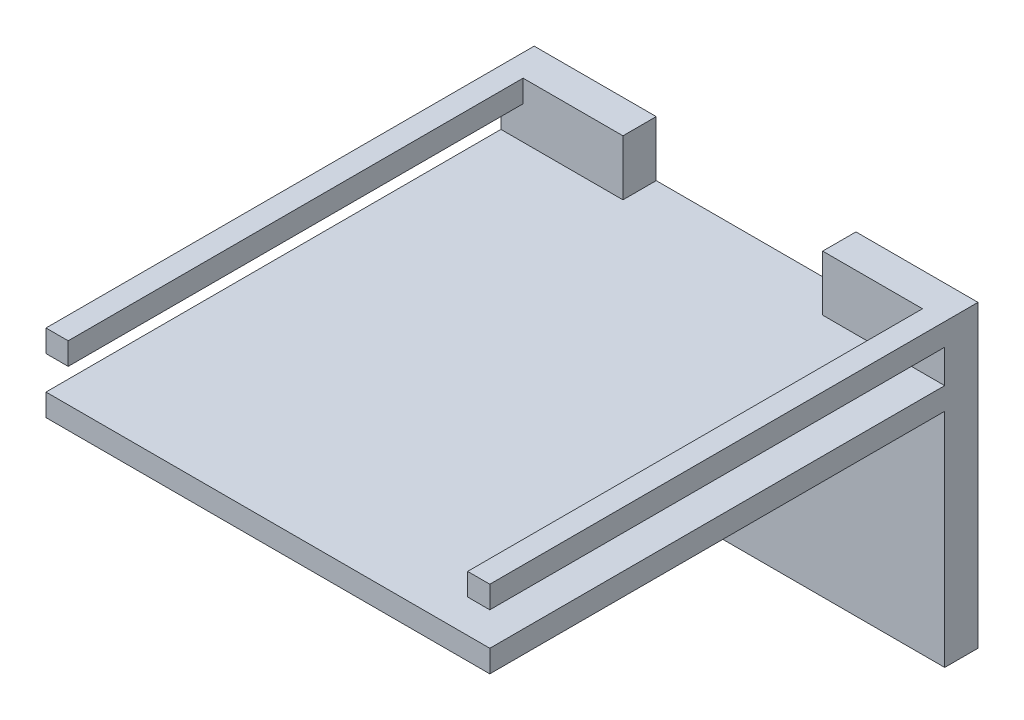
ISO-10303-21;
HEADER;
FILE_DESCRIPTION(('STEP AP214'),'2;1');
FILE_NAME('part.step','',(''),(''),'','','');
FILE_SCHEMA(('AUTOMOTIVE_DESIGN { 1 0 10303 214 1 1 1 1 }'));
ENDSEC;
DATA;
#1=APPLICATION_CONTEXT('core data for automotive mechanical design processes');
#2=APPLICATION_PROTOCOL_DEFINITION('international standard','automotive_design',2000,#1);
#3=PRODUCT_CONTEXT('',#1,'mechanical');
#4=PRODUCT('Part','Part','',(#3));
#5=PRODUCT_RELATED_PRODUCT_CATEGORY('part','',(#4));
#6=PRODUCT_DEFINITION_FORMATION('','',#4);
#7=PRODUCT_DEFINITION_CONTEXT('part definition',#1,'design');
#8=PRODUCT_DEFINITION('design','',#6,#7);
#9=PRODUCT_DEFINITION_SHAPE('','',#8);
#10=(LENGTH_UNIT() NAMED_UNIT(*) SI_UNIT(.MILLI.,.METRE.));
#11=(NAMED_UNIT(*) PLANE_ANGLE_UNIT() SI_UNIT($,.RADIAN.));
#12=(NAMED_UNIT(*) SI_UNIT($,.STERADIAN.) SOLID_ANGLE_UNIT());
#13=UNCERTAINTY_MEASURE_WITH_UNIT(LENGTH_MEASURE(1.E-05),#10,'distance_accuracy_value','');
#14=(GEOMETRIC_REPRESENTATION_CONTEXT(3) GLOBAL_UNCERTAINTY_ASSIGNED_CONTEXT((#13)) GLOBAL_UNIT_ASSIGNED_CONTEXT((#10,
#11,#12)) REPRESENTATION_CONTEXT('',''));
#15=CARTESIAN_POINT('',(0.,0.,0.));
#16=DIRECTION('',(0.,0.,1.));
#17=DIRECTION('',(1.,0.,0.));
#18=AXIS2_PLACEMENT_3D('',#15,#16,#17);
#19=CARTESIAN_POINT('',(7.16043247043311,-0.535464772738769,22.));
#20=DIRECTION('',(0.,-1.,0.));
#21=DIRECTION('',(0.,0.,-1.));
#22=AXIS2_PLACEMENT_3D('',#19,#20,#21);
#23=PLANE('',#22);
#24=DIRECTION('',(-1.,0.,0.));
#25=VECTOR('',#24,1.);
#26=CARTESIAN_POINT('',(7.16043247043311,-0.535464772738769,0.));
#27=LINE('',#26,#25);
#28=CARTESIAN_POINT('',(27.1604324704331,-0.535464772738769,0.));
#29=VERTEX_POINT('',#28);
#30=CARTESIAN_POINT('',(21.6604324704331,-0.535464772738769,0.));
#31=VERTEX_POINT('',#30);
#32=EDGE_CURVE('E330',#29,#31,#27,.T.);
#33=ORIENTED_EDGE('',*,*,#32,.T.);
#34=DIRECTION('',(0.,0.,-1.));
#35=VECTOR('',#34,1.);
#36=CARTESIAN_POINT('',(21.6604324704331,-0.535464772738769,-0.775223484811685));
#37=LINE('',#36,#35);
#38=CARTESIAN_POINT('',(21.6604324704331,-0.535464772738769,1.5));
#39=VERTEX_POINT('',#38);
#40=EDGE_CURVE('E392',#39,#31,#37,.T.);
#41=ORIENTED_EDGE('',*,*,#40,.F.);
#42=DIRECTION('',(-1.,0.,0.));
#43=VECTOR('',#42,1.);
#44=CARTESIAN_POINT('',(7.16043247043311,-0.535464772738769,1.5));
#45=LINE('',#44,#43);
#46=CARTESIAN_POINT('',(26.1604324704331,-0.535464772738768,1.5));
#47=VERTEX_POINT('',#46);
#48=EDGE_CURVE('E11',#47,#39,#45,.T.);
#49=ORIENTED_EDGE('',*,*,#48,.F.);
#50=DIRECTION('',(0.,0.,1.));
#51=VECTOR('',#50,1.);
#52=CARTESIAN_POINT('',(26.1604324704331,-0.535464772738769,22.));
#53=LINE('',#52,#51);
#54=CARTESIAN_POINT('',(26.1604324704331,-0.535464772738768,22.));
#55=VERTEX_POINT('',#54);
#56=EDGE_CURVE('E293',#47,#55,#53,.T.);
#57=ORIENTED_EDGE('',*,*,#56,.T.);
#58=DIRECTION('',(-1.,0.,0.));
#59=VECTOR('',#58,1.);
#60=CARTESIAN_POINT('',(7.16043247043311,-0.535464772738769,22.));
#61=LINE('',#60,#59);
#62=CARTESIAN_POINT('',(27.1604324704331,-0.535464772738769,22.));
#63=VERTEX_POINT('',#62);
#64=EDGE_CURVE('E320',#63,#55,#61,.T.);
#65=ORIENTED_EDGE('',*,*,#64,.F.);
#66=DIRECTION('',(0.,0.,-1.));
#67=VECTOR('',#66,1.);
#68=CARTESIAN_POINT('',(27.1604324704331,-0.535464772738769,22.));
#69=LINE('',#68,#67);
#70=EDGE_CURVE('E337',#63,#29,#69,.T.);
#71=ORIENTED_EDGE('',*,*,#70,.T.);
#72=EDGE_LOOP('',(#33,#41,#49,#57,#65,#71));
#73=FACE_BOUND('',#72,.T.);
#74=ADVANCED_FACE('F39',(#73),#23,.F.);
#75=CARTESIAN_POINT('',(0.,0.,1.5));
#76=DIRECTION('',(0.,0.,1.));
#77=DIRECTION('',(1.,0.,0.));
#78=AXIS2_PLACEMENT_3D('',#75,#76,#77);
#79=PLANE('',#78);
#80=DIRECTION('',(0.,1.,0.));
#81=VECTOR('',#80,1.);
#82=CARTESIAN_POINT('',(21.6604324704331,0.,1.5));
#83=LINE('',#82,#81);
#84=CARTESIAN_POINT('',(21.6604324704331,-3.03546477273877,1.5));
#85=VERTEX_POINT('',#84);
#86=EDGE_CURVE('E191',#85,#39,#83,.T.);
#87=ORIENTED_EDGE('',*,*,#86,.F.);
#88=DIRECTION('',(1.,0.,0.));
#89=VECTOR('',#88,1.);
#90=CARTESIAN_POINT('',(8.16043247043311,-3.03546477273877,1.5));
#91=LINE('',#90,#89);
#92=CARTESIAN_POINT('',(27.1604324704331,-3.03546477273877,1.5));
#93=VERTEX_POINT('',#92);
#94=EDGE_CURVE('E285',#85,#93,#91,.T.);
#95=ORIENTED_EDGE('',*,*,#94,.T.);
#96=DIRECTION('',(0.,1.,0.));
#97=VECTOR('',#96,1.);
#98=CARTESIAN_POINT('',(27.1604324704331,-3.03546477273877,1.5));
#99=LINE('',#98,#97);
#100=CARTESIAN_POINT('',(27.1604324704331,-1.53546477273877,1.5));
#101=VERTEX_POINT('',#100);
#102=EDGE_CURVE('E245',#93,#101,#99,.T.);
#103=ORIENTED_EDGE('',*,*,#102,.T.);
#104=DIRECTION('',(-1.,0.,0.));
#105=VECTOR('',#104,1.);
#106=CARTESIAN_POINT('',(26.1604324704331,-1.53546477273877,1.5));
#107=LINE('',#106,#105);
#108=CARTESIAN_POINT('',(26.1604324704331,-1.53546477273877,1.5));
#109=VERTEX_POINT('',#108);
#110=EDGE_CURVE('E264',#101,#109,#107,.T.);
#111=ORIENTED_EDGE('',*,*,#110,.T.);
#112=DIRECTION('',(0.,1.,0.));
#113=VECTOR('',#112,1.);
#114=CARTESIAN_POINT('',(26.1604324704331,0.765414517211505,1.5));
#115=LINE('',#114,#113);
#116=EDGE_CURVE('E290',#109,#47,#115,.T.);
#117=ORIENTED_EDGE('',*,*,#116,.T.);
#118=ORIENTED_EDGE('',*,*,#48,.T.);
#119=EDGE_LOOP('',(#87,#95,#103,#111,#117,#118));
#120=FACE_BOUND('',#119,.T.);
#121=ADVANCED_FACE('F370',(#120),#79,.T.);
#122=CARTESIAN_POINT('',(7.16043247043311,-4.03546477273877,22.));
#123=DIRECTION('',(0.,1.,0.));
#124=DIRECTION('',(0.,0.,1.));
#125=AXIS2_PLACEMENT_3D('',#122,#123,#124);
#126=PLANE('',#125);
#127=DIRECTION('',(-1.,0.,0.));
#128=VECTOR('',#127,1.);
#129=CARTESIAN_POINT('',(27.1604324704331,-4.03546477273877,1.5));
#130=LINE('',#129,#128);
#131=CARTESIAN_POINT('',(27.1604324704331,-4.03546477273877,1.5));
#132=VERTEX_POINT('',#131);
#133=CARTESIAN_POINT('',(7.16043247043311,-4.03546477273877,1.5));
#134=VERTEX_POINT('',#133);
#135=EDGE_CURVE('E63',#132,#134,#130,.T.);
#136=ORIENTED_EDGE('',*,*,#135,.F.);
#137=DIRECTION('',(0.,0.,-1.));
#138=VECTOR('',#137,1.);
#139=CARTESIAN_POINT('',(27.1604324704331,-4.03546477273877,22.));
#140=LINE('',#139,#138);
#141=CARTESIAN_POINT('',(27.1604324704331,-4.03546477273877,22.));
#142=VERTEX_POINT('',#141);
#143=EDGE_CURVE('E341',#142,#132,#140,.T.);
#144=ORIENTED_EDGE('',*,*,#143,.F.);
#145=DIRECTION('',(1.,0.,0.));
#146=VECTOR('',#145,1.);
#147=CARTESIAN_POINT('',(7.16043247043311,-4.03546477273877,22.));
#148=LINE('',#147,#146);
#149=CARTESIAN_POINT('',(7.16043247043311,-4.03546477273877,22.));
#150=VERTEX_POINT('',#149);
#151=EDGE_CURVE('E310',#150,#142,#148,.T.);
#152=ORIENTED_EDGE('',*,*,#151,.F.);
#153=DIRECTION('',(0.,0.,-1.));
#154=VECTOR('',#153,1.);
#155=CARTESIAN_POINT('',(7.16043247043311,-4.03546477273877,22.));
#156=LINE('',#155,#154);
#157=EDGE_CURVE('E344',#150,#134,#156,.T.);
#158=ORIENTED_EDGE('',*,*,#157,.T.);
#159=EDGE_LOOP('',(#136,#144,#152,#158));
#160=FACE_BOUND('',#159,.T.);
#161=ADVANCED_FACE('F421',(#160),#126,.F.);
#162=CARTESIAN_POINT('',(27.1604324704331,-0.535464772738769,22.));
#163=DIRECTION('',(-1.,0.,0.));
#164=DIRECTION('',(0.,-1.,0.));
#165=AXIS2_PLACEMENT_3D('',#162,#163,#164);
#166=PLANE('',#165);
#167=DIRECTION('',(0.,0.,-1.));
#168=VECTOR('',#167,1.);
#169=CARTESIAN_POINT('',(27.1604324704331,-3.03546477273877,1.5));
#170=LINE('',#169,#168);
#171=CARTESIAN_POINT('',(27.1604324704331,-3.03546477273877,22.));
#172=VERTEX_POINT('',#171);
#173=EDGE_CURVE('E260',#172,#93,#170,.T.);
#174=ORIENTED_EDGE('',*,*,#173,.F.);
#175=DIRECTION('',(0.,1.,0.));
#176=VECTOR('',#175,1.);
#177=CARTESIAN_POINT('',(27.1604324704331,-0.535464772738769,22.));
#178=LINE('',#177,#176);
#179=EDGE_CURVE('E315',#142,#172,#178,.T.);
#180=ORIENTED_EDGE('',*,*,#179,.F.);
#181=ORIENTED_EDGE('',*,*,#143,.T.);
#182=DIRECTION('',(0.,1.,0.));
#183=VECTOR('',#182,1.);
#184=CARTESIAN_POINT('',(27.1604324704331,-14.0354647727388,1.5));
#185=LINE('',#184,#183);
#186=CARTESIAN_POINT('',(27.1604324704331,-14.0354647727388,1.5));
#187=VERTEX_POINT('',#186);
#188=EDGE_CURVE('E229',#187,#132,#185,.T.);
#189=ORIENTED_EDGE('',*,*,#188,.F.);
#190=DIRECTION('',(0.,0.,1.));
#191=VECTOR('',#190,1.);
#192=CARTESIAN_POINT('',(27.1604324704331,-14.0354647727388,0.));
#193=LINE('',#192,#191);
#194=CARTESIAN_POINT('',(27.1604324704331,-14.0354647727388,0.));
#195=VERTEX_POINT('',#194);
#196=EDGE_CURVE('E208',#195,#187,#193,.T.);
#197=ORIENTED_EDGE('',*,*,#196,.F.);
#198=DIRECTION('',(0.,1.,0.));
#199=VECTOR('',#198,1.);
#200=CARTESIAN_POINT('',(27.1604324704331,-0.535464772738769,0.));
#201=LINE('',#200,#199);
#202=EDGE_CURVE('E327',#195,#29,#201,.T.);
#203=ORIENTED_EDGE('',*,*,#202,.T.);
#204=ORIENTED_EDGE('',*,*,#70,.F.);
#205=CARTESIAN_POINT('',(27.1604324704331,-1.53546477273877,22.));
#206=VERTEX_POINT('',#205);
#207=EDGE_CURVE('E314',#206,#63,#178,.T.);
#208=ORIENTED_EDGE('',*,*,#207,.F.);
#209=DIRECTION('',(0.,0.,-1.));
#210=VECTOR('',#209,1.);
#211=CARTESIAN_POINT('',(27.1604324704331,-1.53546477273877,1.5));
#212=LINE('',#211,#210);
#213=EDGE_CURVE('E272',#206,#101,#212,.T.);
#214=ORIENTED_EDGE('',*,*,#213,.T.);
#215=ORIENTED_EDGE('',*,*,#102,.F.);
#216=EDGE_LOOP('',(#174,#180,#181,#189,#197,#203,#204,#208,#214,#215));
#217=FACE_BOUND('',#216,.T.);
#218=ADVANCED_FACE('F376',(#217),#166,.F.);
#219=CARTESIAN_POINT('',(0.,0.,22.));
#220=DIRECTION('',(0.,0.,1.));
#221=DIRECTION('',(1.,0.,0.));
#222=AXIS2_PLACEMENT_3D('',#219,#220,#221);
#223=PLANE('',#222);
#224=DIRECTION('',(0.,-1.,0.));
#225=VECTOR('',#224,1.);
#226=CARTESIAN_POINT('',(7.16043247043311,-0.535464772738769,22.));
#227=LINE('',#226,#225);
#228=CARTESIAN_POINT('',(7.16043247043311,-0.535464772738769,22.));
#229=VERTEX_POINT('',#228);
#230=CARTESIAN_POINT('',(7.16043247043311,-1.53546477273877,22.));
#231=VERTEX_POINT('',#230);
#232=EDGE_CURVE('E306',#229,#231,#227,.T.);
#233=ORIENTED_EDGE('',*,*,#232,.T.);
#234=DIRECTION('',(1.,0.,0.));
#235=VECTOR('',#234,1.);
#236=CARTESIAN_POINT('',(8.16043247043311,-1.53546477273877,22.));
#237=LINE('',#236,#235);
#238=CARTESIAN_POINT('',(8.16043247043311,-1.53546477273877,22.));
#239=VERTEX_POINT('',#238);
#240=EDGE_CURVE('E239',#231,#239,#237,.T.);
#241=ORIENTED_EDGE('',*,*,#240,.T.);
#242=DIRECTION('',(0.,-1.,0.));
#243=VECTOR('',#242,1.);
#244=CARTESIAN_POINT('',(8.16043247043311,0.,22.));
#245=LINE('',#244,#243);
#246=CARTESIAN_POINT('',(8.16043247043311,-0.535464772738768,22.));
#247=VERTEX_POINT('',#246);
#248=EDGE_CURVE('E346',#247,#239,#245,.T.);
#249=ORIENTED_EDGE('',*,*,#248,.F.);
#250=EDGE_CURVE('E319',#247,#229,#61,.T.);
#251=ORIENTED_EDGE('',*,*,#250,.T.);
#252=EDGE_LOOP('',(#233,#241,#249,#251));
#253=FACE_BOUND('',#252,.T.);
#254=ADVANCED_FACE('F413',(#253),#223,.T.);
#255=DIRECTION('',(1.,0.,0.));
#256=VECTOR('',#255,1.);
#257=CARTESIAN_POINT('',(8.16043247043311,-3.03546477273877,22.));
#258=LINE('',#257,#256);
#259=CARTESIAN_POINT('',(7.16043247043311,-3.03546477273877,22.));
#260=VERTEX_POINT('',#259);
#261=EDGE_CURVE('E259',#260,#172,#258,.T.);
#262=ORIENTED_EDGE('',*,*,#261,.F.);
#263=EDGE_CURVE('E311',#260,#150,#227,.T.);
#264=ORIENTED_EDGE('',*,*,#263,.T.);
#265=ORIENTED_EDGE('',*,*,#151,.T.);
#266=ORIENTED_EDGE('',*,*,#179,.T.);
#267=EDGE_LOOP('',(#262,#264,#265,#266));
#268=FACE_BOUND('',#267,.T.);
#269=ADVANCED_FACE('F420',(#268),#223,.T.);
#270=CARTESIAN_POINT('',(8.16043247043311,0.765414517211505,1.5));
#271=DIRECTION('',(-1.,0.,0.));
#272=DIRECTION('',(0.,0.,1.));
#273=AXIS2_PLACEMENT_3D('',#270,#271,#272);
#274=PLANE('',#273);
#275=DIRECTION('',(0.,0.,-1.));
#276=VECTOR('',#275,1.);
#277=CARTESIAN_POINT('',(8.16043247043311,-1.53546477273877,1.5));
#278=LINE('',#277,#276);
#279=CARTESIAN_POINT('',(8.16043247043311,-1.53546477273877,1.5));
#280=VERTEX_POINT('',#279);
#281=EDGE_CURVE('E240',#239,#280,#278,.T.);
#282=ORIENTED_EDGE('',*,*,#281,.T.);
#283=DIRECTION('',(0.,-1.,0.));
#284=VECTOR('',#283,1.);
#285=CARTESIAN_POINT('',(8.16043247043311,0.765414517211505,1.5));
#286=LINE('',#285,#284);
#287=CARTESIAN_POINT('',(8.16043247043311,-0.535464772738768,1.5));
#288=VERTEX_POINT('',#287);
#289=EDGE_CURVE('E281',#288,#280,#286,.T.);
#290=ORIENTED_EDGE('',*,*,#289,.F.);
#291=DIRECTION('',(0.,0.,-1.));
#292=VECTOR('',#291,1.);
#293=CARTESIAN_POINT('',(8.16043247043311,-0.535464772738769,22.));
#294=LINE('',#293,#292);
#295=EDGE_CURVE('E301',#247,#288,#294,.T.);
#296=ORIENTED_EDGE('',*,*,#295,.F.);
#297=ORIENTED_EDGE('',*,*,#248,.T.);
#298=EDGE_LOOP('',(#282,#290,#296,#297));
#299=FACE_BOUND('',#298,.T.);
#300=ADVANCED_FACE('F357',(#299),#274,.F.);
#301=CARTESIAN_POINT('',(7.16043247043311,-0.535464772738769,22.));
#302=DIRECTION('',(1.,0.,0.));
#303=DIRECTION('',(0.,1.,0.));
#304=AXIS2_PLACEMENT_3D('',#301,#302,#303);
#305=PLANE('',#304);
#306=ORIENTED_EDGE('',*,*,#263,.F.);
#307=DIRECTION('',(0.,0.,1.));
#308=VECTOR('',#307,1.);
#309=CARTESIAN_POINT('',(7.16043247043311,-3.03546477273877,1.5));
#310=LINE('',#309,#308);
#311=CARTESIAN_POINT('',(7.16043247043311,-3.03546477273877,1.5));
#312=VERTEX_POINT('',#311);
#313=EDGE_CURVE('E234',#312,#260,#310,.T.);
#314=ORIENTED_EDGE('',*,*,#313,.F.);
#315=DIRECTION('',(0.,1.,0.));
#316=VECTOR('',#315,1.);
#317=CARTESIAN_POINT('',(7.16043247043311,-3.03546477273877,1.5));
#318=LINE('',#317,#316);
#319=CARTESIAN_POINT('',(7.16043247043311,-1.53546477273877,1.5));
#320=VERTEX_POINT('',#319);
#321=EDGE_CURVE('E238',#312,#320,#318,.T.);
#322=ORIENTED_EDGE('',*,*,#321,.T.);
#323=DIRECTION('',(0.,0.,1.));
#324=VECTOR('',#323,1.);
#325=CARTESIAN_POINT('',(7.16043247043311,-1.53546477273877,1.5));
#326=LINE('',#325,#324);
#327=EDGE_CURVE('E249',#320,#231,#326,.T.);
#328=ORIENTED_EDGE('',*,*,#327,.T.);
#329=ORIENTED_EDGE('',*,*,#232,.F.);
#330=DIRECTION('',(0.,0.,-1.));
#331=VECTOR('',#330,1.);
#332=CARTESIAN_POINT('',(7.16043247043311,-0.535464772738769,22.));
#333=LINE('',#332,#331);
#334=CARTESIAN_POINT('',(7.16043247043311,-0.535464772738769,0.));
#335=VERTEX_POINT('',#334);
#336=EDGE_CURVE('E324',#229,#335,#333,.T.);
#337=ORIENTED_EDGE('',*,*,#336,.T.);
#338=DIRECTION('',(0.,-1.,0.));
#339=VECTOR('',#338,1.);
#340=CARTESIAN_POINT('',(7.16043247043311,-0.535464772738769,0.));
#341=LINE('',#340,#339);
#342=CARTESIAN_POINT('',(7.16043247043311,-14.0354647727388,0.));
#343=VERTEX_POINT('',#342);
#344=EDGE_CURVE('E305',#335,#343,#341,.T.);
#345=ORIENTED_EDGE('',*,*,#344,.T.);
#346=DIRECTION('',(0.,0.,-1.));
#347=VECTOR('',#346,1.);
#348=CARTESIAN_POINT('',(7.16043247043311,-14.0354647727388,0.));
#349=LINE('',#348,#347);
#350=CARTESIAN_POINT('',(7.16043247043311,-14.0354647727388,1.5));
#351=VERTEX_POINT('',#350);
#352=EDGE_CURVE('E215',#351,#343,#349,.T.);
#353=ORIENTED_EDGE('',*,*,#352,.F.);
#354=DIRECTION('',(0.,1.,0.));
#355=VECTOR('',#354,1.);
#356=CARTESIAN_POINT('',(7.16043247043311,-14.0354647727388,1.5));
#357=LINE('',#356,#355);
#358=EDGE_CURVE('E223',#351,#134,#357,.T.);
#359=ORIENTED_EDGE('',*,*,#358,.T.);
#360=ORIENTED_EDGE('',*,*,#157,.F.);
#361=EDGE_LOOP('',(#306,#314,#322,#328,#329,#337,#345,#353,#359,#360));
#362=FACE_BOUND('',#361,.T.);
#363=ADVANCED_FACE('F41',(#362),#305,.F.);
#364=CARTESIAN_POINT('',(12.6604324704331,-0.535464772738769,1.5));
#365=VERTEX_POINT('',#364);
#366=EDGE_CURVE('E48',#365,#288,#45,.T.);
#367=ORIENTED_EDGE('',*,*,#366,.F.);
#368=DIRECTION('',(0.,0.,1.));
#369=VECTOR('',#368,1.);
#370=CARTESIAN_POINT('',(12.6604324704331,-0.535464772738769,-0.775223484811685));
#371=LINE('',#370,#369);
#372=CARTESIAN_POINT('',(12.6604324704331,-0.535464772738769,0.));
#373=VERTEX_POINT('',#372);
#374=EDGE_CURVE('E55',#373,#365,#371,.T.);
#375=ORIENTED_EDGE('',*,*,#374,.F.);
#376=EDGE_CURVE('E189',#373,#335,#27,.T.);
#377=ORIENTED_EDGE('',*,*,#376,.T.);
#378=ORIENTED_EDGE('',*,*,#336,.F.);
#379=ORIENTED_EDGE('',*,*,#250,.F.);
#380=ORIENTED_EDGE('',*,*,#295,.T.);
#381=EDGE_LOOP('',(#367,#375,#377,#378,#379,#380));
#382=FACE_BOUND('',#381,.T.);
#383=ADVANCED_FACE('F359',(#382),#23,.F.);
#384=DIRECTION('',(1.,0.,0.));
#385=VECTOR('',#384,1.);
#386=CARTESIAN_POINT('',(26.1604324704331,-1.53546477273877,22.));
#387=LINE('',#386,#385);
#388=CARTESIAN_POINT('',(26.1604324704331,-1.53546477273877,22.));
#389=VERTEX_POINT('',#388);
#390=EDGE_CURVE('E268',#389,#206,#387,.T.);
#391=ORIENTED_EDGE('',*,*,#390,.T.);
#392=ORIENTED_EDGE('',*,*,#207,.T.);
#393=ORIENTED_EDGE('',*,*,#64,.T.);
#394=DIRECTION('',(0.,1.,0.));
#395=VECTOR('',#394,1.);
#396=CARTESIAN_POINT('',(26.1604324704331,0.765414517211505,22.));
#397=LINE('',#396,#395);
#398=EDGE_CURVE('E286',#389,#55,#397,.T.);
#399=ORIENTED_EDGE('',*,*,#398,.F.);
#400=EDGE_LOOP('',(#391,#392,#393,#399));
#401=FACE_BOUND('',#400,.T.);
#402=ADVANCED_FACE('F383',(#401),#223,.T.);
#403=CARTESIAN_POINT('',(0.,0.,0.));
#404=DIRECTION('',(0.,0.,1.));
#405=DIRECTION('',(1.,0.,0.));
#406=AXIS2_PLACEMENT_3D('',#403,#404,#405);
#407=PLANE('',#406);
#408=CARTESIAN_POINT('',(17.1604324704331,-9.03546477273877,0.));
#409=DIRECTION('',(0.,0.,1.));
#410=DIRECTION('',(1.,0.,0.));
#411=AXIS2_PLACEMENT_3D('',#408,#409,#410);
#412=CIRCLE('',#411,1.5);
#413=CARTESIAN_POINT('',(18.6604324704331,-9.03546477273877,0.));
#414=VERTEX_POINT('',#413);
#415=EDGE_CURVE('E204',#414,#414,#412,.T.);
#416=ORIENTED_EDGE('',*,*,#415,.T.);
#417=EDGE_LOOP('',(#416));
#418=FACE_BOUND('',#417,.T.);
#419=DIRECTION('',(1.,0.,0.));
#420=VECTOR('',#419,1.);
#421=CARTESIAN_POINT('',(0.,-3.03546477273877,0.));
#422=LINE('',#421,#420);
#423=CARTESIAN_POINT('',(12.6604324704331,-3.03546477273877,0.));
#424=VERTEX_POINT('',#423);
#425=CARTESIAN_POINT('',(21.6604324704331,-3.03546477273877,0.));
#426=VERTEX_POINT('',#425);
#427=EDGE_CURVE('E167',#424,#426,#422,.T.);
#428=ORIENTED_EDGE('',*,*,#427,.T.);
#429=DIRECTION('',(0.,1.,0.));
#430=VECTOR('',#429,1.);
#431=CARTESIAN_POINT('',(21.6604324704331,0.,0.));
#432=LINE('',#431,#430);
#433=EDGE_CURVE('E179',#426,#31,#432,.T.);
#434=ORIENTED_EDGE('',*,*,#433,.T.);
#435=ORIENTED_EDGE('',*,*,#32,.F.);
#436=ORIENTED_EDGE('',*,*,#202,.F.);
#437=DIRECTION('',(1.,0.,0.));
#438=VECTOR('',#437,1.);
#439=CARTESIAN_POINT('',(27.1604324704331,-14.0354647727388,0.));
#440=LINE('',#439,#438);
#441=EDGE_CURVE('E219',#343,#195,#440,.T.);
#442=ORIENTED_EDGE('',*,*,#441,.F.);
#443=ORIENTED_EDGE('',*,*,#344,.F.);
#444=ORIENTED_EDGE('',*,*,#376,.F.);
#445=DIRECTION('',(0.,-1.,0.));
#446=VECTOR('',#445,1.);
#447=CARTESIAN_POINT('',(12.6604324704331,0.,0.));
#448=LINE('',#447,#446);
#449=EDGE_CURVE('E182',#373,#424,#448,.T.);
#450=ORIENTED_EDGE('',*,*,#449,.T.);
#451=EDGE_LOOP('',(#428,#434,#435,#436,#442,#443,#444,#450));
#452=FACE_BOUND('',#451,.T.);
#453=ADVANCED_FACE('F187',(#418,#452),#407,.F.);
#454=DIRECTION('',(0.,-1.,0.));
#455=VECTOR('',#454,1.);
#456=CARTESIAN_POINT('',(12.6604324704331,0.,1.5));
#457=LINE('',#456,#455);
#458=CARTESIAN_POINT('',(12.6604324704331,-3.03546477273877,1.5));
#459=VERTEX_POINT('',#458);
#460=EDGE_CURVE('E183',#365,#459,#457,.T.);
#461=ORIENTED_EDGE('',*,*,#460,.F.);
#462=ORIENTED_EDGE('',*,*,#366,.T.);
#463=ORIENTED_EDGE('',*,*,#289,.T.);
#464=DIRECTION('',(-1.,0.,0.));
#465=VECTOR('',#464,1.);
#466=CARTESIAN_POINT('',(8.16043247043311,-1.53546477273877,1.5));
#467=LINE('',#466,#465);
#468=EDGE_CURVE('E244',#280,#320,#467,.T.);
#469=ORIENTED_EDGE('',*,*,#468,.T.);
#470=ORIENTED_EDGE('',*,*,#321,.F.);
#471=EDGE_CURVE('E287',#312,#459,#91,.T.);
#472=ORIENTED_EDGE('',*,*,#471,.T.);
#473=EDGE_LOOP('',(#461,#462,#463,#469,#470,#472));
#474=FACE_BOUND('',#473,.T.);
#475=ADVANCED_FACE('F355',(#474),#79,.T.);
#476=CARTESIAN_POINT('',(26.1604324704331,0.765414517211505,1.5));
#477=DIRECTION('',(1.,0.,0.));
#478=DIRECTION('',(0.,0.,-1.));
#479=AXIS2_PLACEMENT_3D('',#476,#477,#478);
#480=PLANE('',#479);
#481=ORIENTED_EDGE('',*,*,#116,.F.);
#482=DIRECTION('',(0.,0.,1.));
#483=VECTOR('',#482,1.);
#484=CARTESIAN_POINT('',(26.1604324704331,-1.53546477273877,1.5));
#485=LINE('',#484,#483);
#486=EDGE_CURVE('E233',#109,#389,#485,.T.);
#487=ORIENTED_EDGE('',*,*,#486,.T.);
#488=ORIENTED_EDGE('',*,*,#398,.T.);
#489=ORIENTED_EDGE('',*,*,#56,.F.);
#490=EDGE_LOOP('',(#481,#487,#488,#489));
#491=FACE_BOUND('',#490,.T.);
#492=ADVANCED_FACE('F388',(#491),#480,.F.);
#493=CARTESIAN_POINT('',(8.16043247043311,-3.03546477273877,1.5));
#494=DIRECTION('',(0.,-1.,0.));
#495=DIRECTION('',(0.,0.,-1.));
#496=AXIS2_PLACEMENT_3D('',#493,#494,#495);
#497=PLANE('',#496);
#498=ORIENTED_EDGE('',*,*,#94,.F.);
#499=DIRECTION('',(0.,0.,-1.));
#500=VECTOR('',#499,1.);
#501=CARTESIAN_POINT('',(21.6604324704331,-3.03546477273877,-0.775223484811685));
#502=LINE('',#501,#500);
#503=EDGE_CURVE('E173',#85,#426,#502,.T.);
#504=ORIENTED_EDGE('',*,*,#503,.T.);
#505=ORIENTED_EDGE('',*,*,#427,.F.);
#506=DIRECTION('',(0.,0.,1.));
#507=VECTOR('',#506,1.);
#508=CARTESIAN_POINT('',(12.6604324704331,-3.03546477273877,-0.775223484811685));
#509=LINE('',#508,#507);
#510=EDGE_CURVE('E171',#424,#459,#509,.T.);
#511=ORIENTED_EDGE('',*,*,#510,.T.);
#512=ORIENTED_EDGE('',*,*,#471,.F.);
#513=ORIENTED_EDGE('',*,*,#313,.T.);
#514=ORIENTED_EDGE('',*,*,#261,.T.);
#515=ORIENTED_EDGE('',*,*,#173,.T.);
#516=EDGE_LOOP('',(#498,#504,#505,#511,#512,#513,#514,#515));
#517=FACE_BOUND('',#516,.T.);
#518=ADVANCED_FACE('F170',(#517),#497,.F.);
#519=CARTESIAN_POINT('',(0.,-1.53546477273877,0.));
#520=DIRECTION('',(0.,1.,0.));
#521=DIRECTION('',(0.,0.,1.));
#522=AXIS2_PLACEMENT_3D('',#519,#520,#521);
#523=PLANE('',#522);
#524=ORIENTED_EDGE('',*,*,#486,.F.);
#525=ORIENTED_EDGE('',*,*,#110,.F.);
#526=ORIENTED_EDGE('',*,*,#213,.F.);
#527=ORIENTED_EDGE('',*,*,#390,.F.);
#528=EDGE_LOOP('',(#524,#525,#526,#527));
#529=FACE_BOUND('',#528,.T.);
#530=ADVANCED_FACE('F380',(#529),#523,.F.);
#531=CARTESIAN_POINT('',(0.,-1.53546477273877,0.));
#532=DIRECTION('',(0.,-1.,0.));
#533=DIRECTION('',(0.,0.,-1.));
#534=AXIS2_PLACEMENT_3D('',#531,#532,#533);
#535=PLANE('',#534);
#536=ORIENTED_EDGE('',*,*,#281,.F.);
#537=ORIENTED_EDGE('',*,*,#240,.F.);
#538=ORIENTED_EDGE('',*,*,#327,.F.);
#539=ORIENTED_EDGE('',*,*,#468,.F.);
#540=EDGE_LOOP('',(#536,#537,#538,#539));
#541=FACE_BOUND('',#540,.T.);
#542=ADVANCED_FACE('F415',(#541),#535,.T.);
#543=CARTESIAN_POINT('',(27.1604324704331,-14.0354647727388,1.5));
#544=DIRECTION('',(0.,0.,-1.));
#545=DIRECTION('',(-1.,0.,0.));
#546=AXIS2_PLACEMENT_3D('',#543,#544,#545);
#547=PLANE('',#546);
#548=CARTESIAN_POINT('',(17.1604324704331,-9.03546477273877,1.5));
#549=DIRECTION('',(0.,0.,1.));
#550=DIRECTION('',(1.,0.,0.));
#551=AXIS2_PLACEMENT_3D('',#548,#549,#550);
#552=CIRCLE('',#551,1.5);
#553=CARTESIAN_POINT('',(18.6604324704331,-9.03546477273877,1.5));
#554=VERTEX_POINT('',#553);
#555=EDGE_CURVE('E178',#554,#554,#552,.T.);
#556=ORIENTED_EDGE('',*,*,#555,.F.);
#557=EDGE_LOOP('',(#556));
#558=FACE_BOUND('',#557,.T.);
#559=ORIENTED_EDGE('',*,*,#135,.T.);
#560=ORIENTED_EDGE('',*,*,#358,.F.);
#561=DIRECTION('',(-1.,0.,0.));
#562=VECTOR('',#561,1.);
#563=CARTESIAN_POINT('',(27.1604324704331,-14.0354647727388,1.5));
#564=LINE('',#563,#562);
#565=EDGE_CURVE('E212',#187,#351,#564,.T.);
#566=ORIENTED_EDGE('',*,*,#565,.F.);
#567=ORIENTED_EDGE('',*,*,#188,.T.);
#568=EDGE_LOOP('',(#559,#560,#566,#567));
#569=FACE_BOUND('',#568,.T.);
#570=ADVANCED_FACE('F408',(#558,#569),#547,.F.);
#571=CARTESIAN_POINT('',(0.,-14.0354647727388,0.));
#572=DIRECTION('',(0.,-1.,0.));
#573=DIRECTION('',(0.,0.,-1.));
#574=AXIS2_PLACEMENT_3D('',#571,#572,#573);
#575=PLANE('',#574);
#576=ORIENTED_EDGE('',*,*,#196,.T.);
#577=ORIENTED_EDGE('',*,*,#565,.T.);
#578=ORIENTED_EDGE('',*,*,#352,.T.);
#579=ORIENTED_EDGE('',*,*,#441,.T.);
#580=EDGE_LOOP('',(#576,#577,#578,#579));
#581=FACE_BOUND('',#580,.T.);
#582=ADVANCED_FACE('F404',(#581),#575,.T.);
#583=CARTESIAN_POINT('',(17.1604324704331,-9.03546477273877,-5.5));
#584=DIRECTION('',(0.,0.,1.));
#585=DIRECTION('',(1.,0.,0.));
#586=AXIS2_PLACEMENT_3D('',#583,#584,#585);
#587=CYLINDRICAL_SURFACE('',#586,1.5);
#588=ORIENTED_EDGE('',*,*,#555,.T.);
#589=EDGE_LOOP('',(#588));
#590=FACE_BOUND('',#589,.T.);
#591=ORIENTED_EDGE('',*,*,#415,.F.);
#592=EDGE_LOOP('',(#591));
#593=FACE_BOUND('',#592,.T.);
#594=ADVANCED_FACE('F456',(#590,#593),#587,.F.);
#595=CARTESIAN_POINT('',(21.6604324704331,-12.6987910434725,-0.775223484811685));
#596=DIRECTION('',(1.,0.,0.));
#597=DIRECTION('',(0.,0.,-1.));
#598=AXIS2_PLACEMENT_3D('',#595,#596,#597);
#599=PLANE('',#598);
#600=ORIENTED_EDGE('',*,*,#503,.F.);
#601=ORIENTED_EDGE('',*,*,#86,.T.);
#602=ORIENTED_EDGE('',*,*,#40,.T.);
#603=ORIENTED_EDGE('',*,*,#433,.F.);
#604=EDGE_LOOP('',(#600,#601,#602,#603));
#605=FACE_BOUND('',#604,.T.);
#606=ADVANCED_FACE('F400',(#605),#599,.F.);
#607=CARTESIAN_POINT('',(12.6604324704331,-12.6987910434725,-0.775223484811685));
#608=DIRECTION('',(-1.,0.,0.));
#609=DIRECTION('',(0.,0.,1.));
#610=AXIS2_PLACEMENT_3D('',#607,#608,#609);
#611=PLANE('',#610);
#612=ORIENTED_EDGE('',*,*,#374,.T.);
#613=ORIENTED_EDGE('',*,*,#460,.T.);
#614=ORIENTED_EDGE('',*,*,#510,.F.);
#615=ORIENTED_EDGE('',*,*,#449,.F.);
#616=EDGE_LOOP('',(#612,#613,#614,#615));
#617=FACE_BOUND('',#616,.T.);
#618=ADVANCED_FACE('F181',(#617),#611,.F.);
#619=CLOSED_SHELL('',(#74,#121,#161,#218,#254,#269,#300,#363,#383,#402,#453,#475,#492,#518,#530,
#542,#570,#582,#594,#606,#618));
#620=MANIFOLD_SOLID_BREP('B2',#619);
#621=ADVANCED_BREP_SHAPE_REPRESENTATION('',(#18,#620),#14);
#622=SHAPE_DEFINITION_REPRESENTATION(#9,#621);
ENDSEC;
END-ISO-10303-21;
